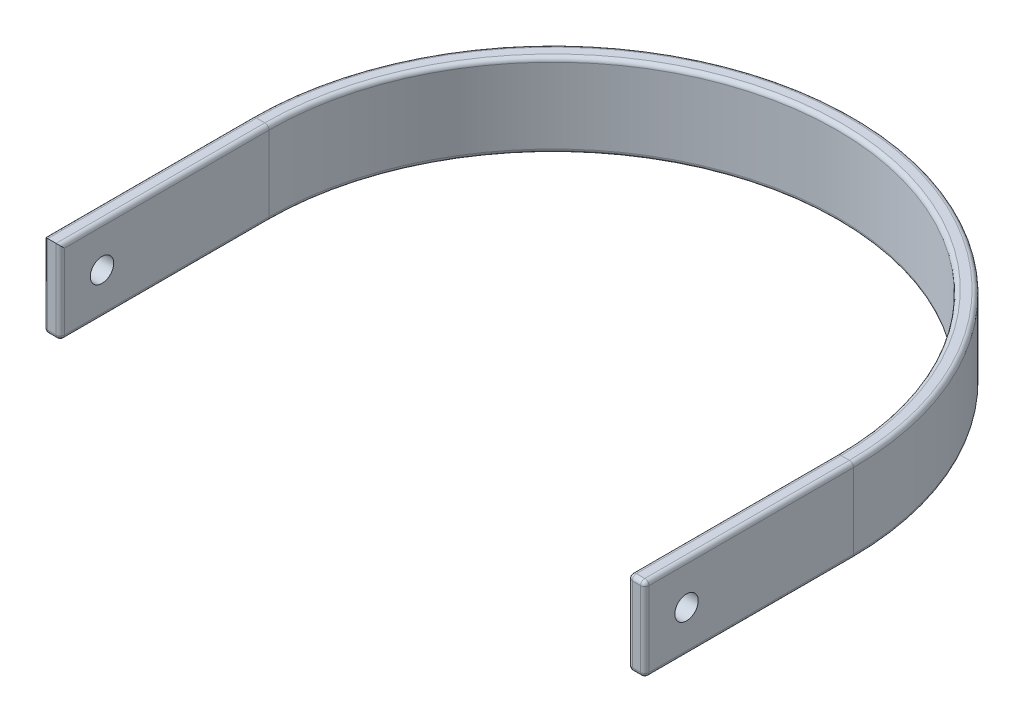
ISO-10303-21;
HEADER;
FILE_DESCRIPTION(('STEP AP214'),'2;1');
FILE_NAME('part.step','',(''),(''),'','','');
FILE_SCHEMA(('AUTOMOTIVE_DESIGN { 1 0 10303 214 1 1 1 1 }'));
ENDSEC;
DATA;
#1=APPLICATION_CONTEXT('core data for automotive mechanical design processes');
#2=APPLICATION_PROTOCOL_DEFINITION('international standard','automotive_design',2000,#1);
#3=PRODUCT_CONTEXT('',#1,'mechanical');
#4=PRODUCT('Part','Part','',(#3));
#5=PRODUCT_RELATED_PRODUCT_CATEGORY('part','',(#4));
#6=PRODUCT_DEFINITION_FORMATION('','',#4);
#7=PRODUCT_DEFINITION_CONTEXT('part definition',#1,'design');
#8=PRODUCT_DEFINITION('design','',#6,#7);
#9=PRODUCT_DEFINITION_SHAPE('','',#8);
#10=(LENGTH_UNIT() NAMED_UNIT(*) SI_UNIT(.MILLI.,.METRE.));
#11=(NAMED_UNIT(*) PLANE_ANGLE_UNIT() SI_UNIT($,.RADIAN.));
#12=(NAMED_UNIT(*) SI_UNIT($,.STERADIAN.) SOLID_ANGLE_UNIT());
#13=UNCERTAINTY_MEASURE_WITH_UNIT(LENGTH_MEASURE(1.E-05),#10,'distance_accuracy_value','');
#14=(GEOMETRIC_REPRESENTATION_CONTEXT(3) GLOBAL_UNCERTAINTY_ASSIGNED_CONTEXT((#13)) GLOBAL_UNIT_ASSIGNED_CONTEXT((#10,
#11,#12)) REPRESENTATION_CONTEXT('',''));
#15=CARTESIAN_POINT('',(0.,0.,0.));
#16=DIRECTION('',(0.,0.,1.));
#17=DIRECTION('',(1.,0.,0.));
#18=AXIS2_PLACEMENT_3D('',#15,#16,#17);
#19=CARTESIAN_POINT('',(0.,0.,0.));
#20=DIRECTION('',(0.,0.,1.));
#21=DIRECTION('',(1.,0.,0.));
#22=AXIS2_PLACEMENT_3D('',#19,#20,#21);
#23=PLANE('',#22);
#24=DIRECTION('',(1.,0.,0.));
#25=VECTOR('',#24,1.);
#26=CARTESIAN_POINT('',(1.,-4.5,0.));
#27=LINE('',#26,#25);
#28=CARTESIAN_POINT('',(-0.499999999999999,-4.5,0.));
#29=VERTEX_POINT('',#28);
#30=CARTESIAN_POINT('',(0.500000000000001,-4.5,0.));
#31=VERTEX_POINT('',#30);
#32=EDGE_CURVE('E194',#29,#31,#27,.T.);
#33=ORIENTED_EDGE('',*,*,#32,.T.);
#34=DIRECTION('',(0.,1.,0.));
#35=VECTOR('',#34,1.);
#36=CARTESIAN_POINT('',(0.5,5.,0.));
#37=LINE('',#36,#35);
#38=CARTESIAN_POINT('',(0.5,5.,0.));
#39=VERTEX_POINT('',#38);
#40=EDGE_CURVE('E177',#31,#39,#37,.T.);
#41=ORIENTED_EDGE('',*,*,#40,.T.);
#42=DIRECTION('',(-1.,0.,0.));
#43=VECTOR('',#42,1.);
#44=CARTESIAN_POINT('',(-1.,5.,0.));
#45=LINE('',#44,#43);
#46=CARTESIAN_POINT('',(-0.5,5.,0.));
#47=VERTEX_POINT('',#46);
#48=EDGE_CURVE('E191',#39,#47,#45,.T.);
#49=ORIENTED_EDGE('',*,*,#48,.T.);
#50=DIRECTION('',(0.,-1.,0.));
#51=VECTOR('',#50,1.);
#52=CARTESIAN_POINT('',(-0.499999999999999,-5.,0.));
#53=LINE('',#52,#51);
#54=EDGE_CURVE('E198',#47,#29,#53,.T.);
#55=ORIENTED_EDGE('',*,*,#54,.T.);
#56=EDGE_LOOP('',(#33,#41,#49,#55));
#57=FACE_BOUND('',#56,.T.);
#58=ADVANCED_FACE('F39',(#57),#23,.T.);
#59=CARTESIAN_POINT('',(70.,0.,0.));
#60=DIRECTION('',(0.,0.,-1.));
#61=DIRECTION('',(-1.,0.,0.));
#62=AXIS2_PLACEMENT_3D('',#59,#60,#61);
#63=PLANE('',#62);
#64=DIRECTION('',(0.,1.,0.));
#65=VECTOR('',#64,1.);
#66=CARTESIAN_POINT('',(69.5,0.,0.));
#67=LINE('',#66,#65);
#68=CARTESIAN_POINT('',(69.5,4.5,0.));
#69=VERTEX_POINT('',#68);
#70=CARTESIAN_POINT('',(69.5,-4.5,0.));
#71=VERTEX_POINT('',#70);
#72=EDGE_CURVE('E283',#69,#71,#67,.F.);
#73=ORIENTED_EDGE('',*,*,#72,.T.);
#74=DIRECTION('',(-1.,0.,0.));
#75=VECTOR('',#74,1.);
#76=CARTESIAN_POINT('',(70.,-4.5,0.));
#77=LINE('',#76,#75);
#78=CARTESIAN_POINT('',(70.5,-4.5,0.));
#79=VERTEX_POINT('',#78);
#80=EDGE_CURVE('E292',#71,#79,#77,.F.);
#81=ORIENTED_EDGE('',*,*,#80,.T.);
#82=DIRECTION('',(0.,-1.,0.));
#83=VECTOR('',#82,1.);
#84=CARTESIAN_POINT('',(70.5,0.,0.));
#85=LINE('',#84,#83);
#86=CARTESIAN_POINT('',(70.5,4.5,0.));
#87=VERTEX_POINT('',#86);
#88=EDGE_CURVE('E289',#79,#87,#85,.F.);
#89=ORIENTED_EDGE('',*,*,#88,.T.);
#90=DIRECTION('',(1.,0.,0.));
#91=VECTOR('',#90,1.);
#92=CARTESIAN_POINT('',(70.,4.5,0.));
#93=LINE('',#92,#91);
#94=EDGE_CURVE('E286',#87,#69,#93,.F.);
#95=ORIENTED_EDGE('',*,*,#94,.T.);
#96=EDGE_LOOP('',(#73,#81,#89,#95));
#97=FACE_BOUND('',#96,.T.);
#98=ADVANCED_FACE('F557',(#97),#63,.F.);
#99=CARTESIAN_POINT('',(-1.,5.,0.));
#100=DIRECTION('',(1.,0.,0.));
#101=DIRECTION('',(0.,1.,0.));
#102=AXIS2_PLACEMENT_3D('',#99,#100,#101);
#103=PLANE('',#102);
#104=CARTESIAN_POINT('',(-1.,0.,-5.));
#105=DIRECTION('',(-1.,0.,0.));
#106=DIRECTION('',(0.,-1.,0.));
#107=AXIS2_PLACEMENT_3D('',#104,#105,#106);
#108=CIRCLE('',#107,1.4);
#109=CARTESIAN_POINT('',(-1.,-1.4,-5.));
#110=VERTEX_POINT('',#109);
#111=EDGE_CURVE('E230',#110,#110,#108,.T.);
#112=ORIENTED_EDGE('',*,*,#111,.F.);
#113=EDGE_LOOP('',(#112));
#114=FACE_BOUND('',#113,.T.);
#115=DIRECTION('',(0.,-1.,0.));
#116=VECTOR('',#115,1.);
#117=CARTESIAN_POINT('',(-1.,5.,-25.));
#118=LINE('',#117,#116);
#119=CARTESIAN_POINT('',(-1.,4.5,-25.));
#120=VERTEX_POINT('',#119);
#121=CARTESIAN_POINT('',(-0.999999999999999,-4.5,-25.));
#122=VERTEX_POINT('',#121);
#123=EDGE_CURVE('E203',#120,#122,#118,.T.);
#124=ORIENTED_EDGE('',*,*,#123,.T.);
#125=DIRECTION('',(0.,0.,-1.));
#126=VECTOR('',#125,1.);
#127=CARTESIAN_POINT('',(-0.999999999999999,-4.5,0.));
#128=LINE('',#127,#126);
#129=CARTESIAN_POINT('',(-0.999999999999999,-4.5,-0.5));
#130=VERTEX_POINT('',#129);
#131=EDGE_CURVE('E249',#122,#130,#128,.F.);
#132=ORIENTED_EDGE('',*,*,#131,.T.);
#133=DIRECTION('',(0.,-1.,0.));
#134=VECTOR('',#133,1.);
#135=CARTESIAN_POINT('',(-1.,5.,-0.5));
#136=LINE('',#135,#134);
#137=CARTESIAN_POINT('',(-1.,4.5,-0.5));
#138=VERTEX_POINT('',#137);
#139=EDGE_CURVE('E245',#130,#138,#136,.F.);
#140=ORIENTED_EDGE('',*,*,#139,.T.);
#141=DIRECTION('',(0.,0.,-1.));
#142=VECTOR('',#141,1.);
#143=CARTESIAN_POINT('',(-1.,4.5,0.));
#144=LINE('',#143,#142);
#145=EDGE_CURVE('E242',#138,#120,#144,.T.);
#146=ORIENTED_EDGE('',*,*,#145,.T.);
#147=EDGE_LOOP('',(#124,#132,#140,#146));
#148=FACE_BOUND('',#147,.T.);
#149=ADVANCED_FACE('F589',(#114,#148),#103,.F.);
#150=CARTESIAN_POINT('',(-0.999999999999999,-5.,0.));
#151=DIRECTION('',(0.,1.,0.));
#152=DIRECTION('',(-1.,0.,0.));
#153=AXIS2_PLACEMENT_3D('',#150,#151,#152);
#154=PLANE('',#153);
#155=DIRECTION('',(1.,0.,0.));
#156=VECTOR('',#155,1.);
#157=CARTESIAN_POINT('',(-0.999999999999999,-5.,-25.));
#158=LINE('',#157,#156);
#159=CARTESIAN_POINT('',(-0.499999999999999,-5.,-25.));
#160=VERTEX_POINT('',#159);
#161=CARTESIAN_POINT('',(0.5,-5.,-25.));
#162=VERTEX_POINT('',#161);
#163=EDGE_CURVE('E209',#160,#162,#158,.T.);
#164=ORIENTED_EDGE('',*,*,#163,.T.);
#165=DIRECTION('',(0.,0.,-1.));
#166=VECTOR('',#165,1.);
#167=CARTESIAN_POINT('',(0.5,-5.,0.));
#168=LINE('',#167,#166);
#169=CARTESIAN_POINT('',(0.500000000000001,-5.,-0.5));
#170=VERTEX_POINT('',#169);
#171=EDGE_CURVE('E259',#162,#170,#168,.F.);
#172=ORIENTED_EDGE('',*,*,#171,.T.);
#173=DIRECTION('',(1.,0.,0.));
#174=VECTOR('',#173,1.);
#175=CARTESIAN_POINT('',(-0.999999999999999,-5.,-0.5));
#176=LINE('',#175,#174);
#177=CARTESIAN_POINT('',(-0.499999999999999,-5.,-0.5));
#178=VERTEX_POINT('',#177);
#179=EDGE_CURVE('E255',#170,#178,#176,.F.);
#180=ORIENTED_EDGE('',*,*,#179,.T.);
#181=DIRECTION('',(0.,0.,-1.));
#182=VECTOR('',#181,1.);
#183=CARTESIAN_POINT('',(-0.499999999999999,-5.,0.));
#184=LINE('',#183,#182);
#185=EDGE_CURVE('E252',#178,#160,#184,.T.);
#186=ORIENTED_EDGE('',*,*,#185,.T.);
#187=EDGE_LOOP('',(#164,#172,#180,#186));
#188=FACE_BOUND('',#187,.T.);
#189=ADVANCED_FACE('F879',(#188),#154,.F.);
#190=CARTESIAN_POINT('',(1.,5.,0.));
#191=DIRECTION('',(-1.,0.,0.));
#192=DIRECTION('',(0.,-1.,0.));
#193=AXIS2_PLACEMENT_3D('',#190,#191,#192);
#194=PLANE('',#193);
#195=CARTESIAN_POINT('',(1.,0.,-5.));
#196=DIRECTION('',(-1.,0.,0.));
#197=DIRECTION('',(0.,-1.,0.));
#198=AXIS2_PLACEMENT_3D('',#195,#196,#197);
#199=CIRCLE('',#198,1.4);
#200=CARTESIAN_POINT('',(1.,-1.4,-5.));
#201=VERTEX_POINT('',#200);
#202=EDGE_CURVE('E204',#201,#201,#199,.T.);
#203=ORIENTED_EDGE('',*,*,#202,.T.);
#204=EDGE_LOOP('',(#203));
#205=FACE_BOUND('',#204,.T.);
#206=DIRECTION('',(0.,1.,0.));
#207=VECTOR('',#206,1.);
#208=CARTESIAN_POINT('',(1.,-5.,-0.5));
#209=LINE('',#208,#207);
#210=CARTESIAN_POINT('',(1.,4.5,-0.5));
#211=VERTEX_POINT('',#210);
#212=CARTESIAN_POINT('',(1.,-4.5,-0.5));
#213=VERTEX_POINT('',#212);
#214=EDGE_CURVE('E179',#211,#213,#209,.F.);
#215=ORIENTED_EDGE('',*,*,#214,.T.);
#216=DIRECTION('',(0.,0.,-1.));
#217=VECTOR('',#216,1.);
#218=CARTESIAN_POINT('',(1.,-4.5,0.));
#219=LINE('',#218,#217);
#220=CARTESIAN_POINT('',(1.,-4.5,-25.));
#221=VERTEX_POINT('',#220);
#222=EDGE_CURVE('E239',#213,#221,#219,.T.);
#223=ORIENTED_EDGE('',*,*,#222,.T.);
#224=DIRECTION('',(0.,1.,0.));
#225=VECTOR('',#224,1.);
#226=CARTESIAN_POINT('',(1.,5.,-25.));
#227=LINE('',#226,#225);
#228=CARTESIAN_POINT('',(1.,4.5,-25.));
#229=VERTEX_POINT('',#228);
#230=EDGE_CURVE('E222',#221,#229,#227,.T.);
#231=ORIENTED_EDGE('',*,*,#230,.T.);
#232=DIRECTION('',(0.,0.,-1.));
#233=VECTOR('',#232,1.);
#234=CARTESIAN_POINT('',(1.,4.5,0.));
#235=LINE('',#234,#233);
#236=EDGE_CURVE('E197',#229,#211,#235,.F.);
#237=ORIENTED_EDGE('',*,*,#236,.T.);
#238=EDGE_LOOP('',(#215,#223,#231,#237));
#239=FACE_BOUND('',#238,.T.);
#240=ADVANCED_FACE('F464',(#205,#239),#194,.F.);
#241=CARTESIAN_POINT('',(-1.,5.,0.));
#242=DIRECTION('',(0.,-1.,0.));
#243=DIRECTION('',(0.,0.,-1.));
#244=AXIS2_PLACEMENT_3D('',#241,#242,#243);
#245=PLANE('',#244);
#246=ORIENTED_EDGE('',*,*,#48,.F.);
#247=DIRECTION('',(0.,0.,-1.));
#248=VECTOR('',#247,1.);
#249=CARTESIAN_POINT('',(0.5,5.,0.));
#250=LINE('',#249,#248);
#251=CARTESIAN_POINT('',(0.5,5.,-25.));
#252=VERTEX_POINT('',#251);
#253=EDGE_CURVE('E11',#39,#252,#250,.T.);
#254=ORIENTED_EDGE('',*,*,#253,.T.);
#255=DIRECTION('',(-1.,0.,0.));
#256=VECTOR('',#255,1.);
#257=CARTESIAN_POINT('',(-1.,5.,-25.));
#258=LINE('',#257,#256);
#259=CARTESIAN_POINT('',(-0.5,5.,-25.));
#260=VERTEX_POINT('',#259);
#261=EDGE_CURVE('E218',#252,#260,#258,.T.);
#262=ORIENTED_EDGE('',*,*,#261,.T.);
#263=DIRECTION('',(0.,0.,-1.));
#264=VECTOR('',#263,1.);
#265=CARTESIAN_POINT('',(-0.5,5.,0.));
#266=LINE('',#265,#264);
#267=EDGE_CURVE('E49',#260,#47,#266,.F.);
#268=ORIENTED_EDGE('',*,*,#267,.T.);
#269=EDGE_LOOP('',(#246,#254,#262,#268));
#270=FACE_BOUND('',#269,.T.);
#271=ADVANCED_FACE('F200',(#270),#245,.F.);
#272=CARTESIAN_POINT('',(35.,0.,-25.));
#273=DIRECTION('',(0.,-1.,0.));
#274=DIRECTION('',(0.,0.,-1.));
#275=AXIS2_PLACEMENT_3D('',#272,#273,#274);
#276=CYLINDRICAL_SURFACE('',#275,36.);
#277=DIRECTION('',(0.,-1.,0.));
#278=VECTOR('',#277,1.);
#279=CARTESIAN_POINT('',(71.,5.,-25.));
#280=LINE('',#279,#278);
#281=CARTESIAN_POINT('',(71.,4.5,-25.));
#282=VERTEX_POINT('',#281);
#283=CARTESIAN_POINT('',(71.,-4.5,-25.));
#284=VERTEX_POINT('',#283);
#285=EDGE_CURVE('E221',#282,#284,#280,.T.);
#286=ORIENTED_EDGE('',*,*,#285,.T.);
#287=CARTESIAN_POINT('',(35.,-4.5,-25.));
#288=DIRECTION('',(0.,1.,0.));
#289=DIRECTION('',(0.,0.,1.));
#290=AXIS2_PLACEMENT_3D('',#287,#288,#289);
#291=CIRCLE('',#290,36.);
#292=EDGE_CURVE('E326',#284,#122,#291,.T.);
#293=ORIENTED_EDGE('',*,*,#292,.T.);
#294=ORIENTED_EDGE('',*,*,#123,.F.);
#295=CARTESIAN_POINT('',(35.,4.5,-25.));
#296=DIRECTION('',(0.,-1.,0.));
#297=DIRECTION('',(0.,0.,-1.));
#298=AXIS2_PLACEMENT_3D('',#295,#296,#297);
#299=CIRCLE('',#298,36.);
#300=EDGE_CURVE('E323',#120,#282,#299,.T.);
#301=ORIENTED_EDGE('',*,*,#300,.T.);
#302=EDGE_LOOP('',(#286,#293,#294,#301));
#303=FACE_BOUND('',#302,.T.);
#304=ADVANCED_FACE('F856',(#303),#276,.T.);
#305=CARTESIAN_POINT('',(-0.999999999999999,-5.,-25.));
#306=DIRECTION('',(0.,1.,0.));
#307=DIRECTION('',(0.,0.,1.));
#308=AXIS2_PLACEMENT_3D('',#305,#306,#307);
#309=PLANE('',#308);
#310=DIRECTION('',(-1.,0.,0.));
#311=VECTOR('',#310,1.);
#312=CARTESIAN_POINT('',(71.,-5.,-25.));
#313=LINE('',#312,#311);
#314=CARTESIAN_POINT('',(70.5,-5.,-25.));
#315=VERTEX_POINT('',#314);
#316=CARTESIAN_POINT('',(69.5,-5.,-25.));
#317=VERTEX_POINT('',#316);
#318=EDGE_CURVE('E454',#315,#317,#313,.T.);
#319=ORIENTED_EDGE('',*,*,#318,.T.);
#320=CARTESIAN_POINT('',(35.,-5.,-25.));
#321=DIRECTION('',(0.,1.,0.));
#322=DIRECTION('',(0.,0.,1.));
#323=AXIS2_PLACEMENT_3D('',#320,#321,#322);
#324=CIRCLE('',#323,34.5);
#325=EDGE_CURVE('E271',#317,#162,#324,.T.);
#326=ORIENTED_EDGE('',*,*,#325,.T.);
#327=ORIENTED_EDGE('',*,*,#163,.F.);
#328=CARTESIAN_POINT('',(35.,-5.,-25.));
#329=DIRECTION('',(0.,1.,0.));
#330=DIRECTION('',(0.,0.,1.));
#331=AXIS2_PLACEMENT_3D('',#328,#329,#330);
#332=CIRCLE('',#331,35.5);
#333=EDGE_CURVE('E268',#160,#315,#332,.F.);
#334=ORIENTED_EDGE('',*,*,#333,.T.);
#335=EDGE_LOOP('',(#319,#326,#327,#334));
#336=FACE_BOUND('',#335,.T.);
#337=ADVANCED_FACE('F848',(#336),#309,.F.);
#338=CARTESIAN_POINT('',(35.,0.,-25.));
#339=DIRECTION('',(0.,-1.,0.));
#340=DIRECTION('',(0.,0.,-1.));
#341=AXIS2_PLACEMENT_3D('',#338,#339,#340);
#342=CYLINDRICAL_SURFACE('',#341,34.);
#343=ORIENTED_EDGE('',*,*,#230,.F.);
#344=CARTESIAN_POINT('',(35.,-4.5,-25.));
#345=DIRECTION('',(0.,1.,0.));
#346=DIRECTION('',(0.,0.,1.));
#347=AXIS2_PLACEMENT_3D('',#344,#345,#346);
#348=CIRCLE('',#347,34.);
#349=CARTESIAN_POINT('',(69.,-4.5,-25.));
#350=VERTEX_POINT('',#349);
#351=EDGE_CURVE('E265',#221,#350,#348,.F.);
#352=ORIENTED_EDGE('',*,*,#351,.T.);
#353=DIRECTION('',(0.,1.,0.));
#354=VECTOR('',#353,1.);
#355=CARTESIAN_POINT('',(69.,5.,-25.));
#356=LINE('',#355,#354);
#357=CARTESIAN_POINT('',(69.,4.5,-25.));
#358=VERTEX_POINT('',#357);
#359=EDGE_CURVE('E216',#350,#358,#356,.T.);
#360=ORIENTED_EDGE('',*,*,#359,.T.);
#361=CARTESIAN_POINT('',(35.,4.5,-25.));
#362=DIRECTION('',(0.,-1.,0.));
#363=DIRECTION('',(0.,0.,-1.));
#364=AXIS2_PLACEMENT_3D('',#361,#362,#363);
#365=CIRCLE('',#364,34.);
#366=EDGE_CURVE('E262',#358,#229,#365,.F.);
#367=ORIENTED_EDGE('',*,*,#366,.T.);
#368=EDGE_LOOP('',(#343,#352,#360,#367));
#369=FACE_BOUND('',#368,.T.);
#370=ADVANCED_FACE('F539',(#369),#342,.F.);
#371=CARTESIAN_POINT('',(-1.,5.,-25.));
#372=DIRECTION('',(0.,-1.,0.));
#373=DIRECTION('',(0.,0.,-1.));
#374=AXIS2_PLACEMENT_3D('',#371,#372,#373);
#375=PLANE('',#374);
#376=ORIENTED_EDGE('',*,*,#261,.F.);
#377=CARTESIAN_POINT('',(35.,5.,-25.));
#378=DIRECTION('',(0.,-1.,0.));
#379=DIRECTION('',(0.,0.,-1.));
#380=AXIS2_PLACEMENT_3D('',#377,#378,#379);
#381=CIRCLE('',#380,34.5);
#382=CARTESIAN_POINT('',(69.5,5.,-25.));
#383=VERTEX_POINT('',#382);
#384=EDGE_CURVE('E331',#252,#383,#381,.T.);
#385=ORIENTED_EDGE('',*,*,#384,.T.);
#386=DIRECTION('',(1.,0.,0.));
#387=VECTOR('',#386,1.);
#388=CARTESIAN_POINT('',(71.,5.,-25.));
#389=LINE('',#388,#387);
#390=CARTESIAN_POINT('',(70.5,5.,-25.));
#391=VERTEX_POINT('',#390);
#392=EDGE_CURVE('E223',#383,#391,#389,.T.);
#393=ORIENTED_EDGE('',*,*,#392,.T.);
#394=CARTESIAN_POINT('',(35.,5.,-25.));
#395=DIRECTION('',(0.,-1.,0.));
#396=DIRECTION('',(0.,0.,-1.));
#397=AXIS2_PLACEMENT_3D('',#394,#395,#396);
#398=CIRCLE('',#397,35.5);
#399=EDGE_CURVE('E57',#391,#260,#398,.F.);
#400=ORIENTED_EDGE('',*,*,#399,.T.);
#401=EDGE_LOOP('',(#376,#385,#393,#400));
#402=FACE_BOUND('',#401,.T.);
#403=ADVANCED_FACE('F474',(#402),#375,.F.);
#404=CARTESIAN_POINT('',(71.,5.,-25.));
#405=DIRECTION('',(-1.,0.,0.));
#406=DIRECTION('',(0.,-1.,0.));
#407=AXIS2_PLACEMENT_3D('',#404,#405,#406);
#408=PLANE('',#407);
#409=CARTESIAN_POINT('',(71.,0.,-5.));
#410=DIRECTION('',(-1.,0.,0.));
#411=DIRECTION('',(0.,-1.,0.));
#412=AXIS2_PLACEMENT_3D('',#409,#410,#411);
#413=CIRCLE('',#412,1.4);
#414=CARTESIAN_POINT('',(71.,-1.39999999999999,-5.));
#415=VERTEX_POINT('',#414);
#416=EDGE_CURVE('E212',#415,#415,#413,.T.);
#417=ORIENTED_EDGE('',*,*,#416,.T.);
#418=EDGE_LOOP('',(#417));
#419=FACE_BOUND('',#418,.T.);
#420=DIRECTION('',(0.,-1.,0.));
#421=VECTOR('',#420,1.);
#422=CARTESIAN_POINT('',(71.,5.,-0.5));
#423=LINE('',#422,#421);
#424=CARTESIAN_POINT('',(71.,4.5,-0.5));
#425=VERTEX_POINT('',#424);
#426=CARTESIAN_POINT('',(71.,-4.5,-0.5));
#427=VERTEX_POINT('',#426);
#428=EDGE_CURVE('E299',#425,#427,#423,.T.);
#429=ORIENTED_EDGE('',*,*,#428,.T.);
#430=DIRECTION('',(0.,0.,1.));
#431=VECTOR('',#430,1.);
#432=CARTESIAN_POINT('',(71.,-4.5,-25.));
#433=LINE('',#432,#431);
#434=EDGE_CURVE('E302',#427,#284,#433,.F.);
#435=ORIENTED_EDGE('',*,*,#434,.T.);
#436=ORIENTED_EDGE('',*,*,#285,.F.);
#437=DIRECTION('',(0.,0.,1.));
#438=VECTOR('',#437,1.);
#439=CARTESIAN_POINT('',(71.,4.5,-25.));
#440=LINE('',#439,#438);
#441=EDGE_CURVE('E296',#282,#425,#440,.T.);
#442=ORIENTED_EDGE('',*,*,#441,.T.);
#443=EDGE_LOOP('',(#429,#435,#436,#442));
#444=FACE_BOUND('',#443,.T.);
#445=ADVANCED_FACE('F502',(#419,#444),#408,.F.);
#446=CARTESIAN_POINT('',(71.,-5.,-25.));
#447=DIRECTION('',(0.,1.,0.));
#448=DIRECTION('',(-1.,0.,0.));
#449=AXIS2_PLACEMENT_3D('',#446,#447,#448);
#450=PLANE('',#449);
#451=ORIENTED_EDGE('',*,*,#318,.F.);
#452=DIRECTION('',(0.,0.,1.));
#453=VECTOR('',#452,1.);
#454=CARTESIAN_POINT('',(70.5,-5.,-25.));
#455=LINE('',#454,#453);
#456=CARTESIAN_POINT('',(70.5,-5.,-0.5));
#457=VERTEX_POINT('',#456);
#458=EDGE_CURVE('E280',#315,#457,#455,.T.);
#459=ORIENTED_EDGE('',*,*,#458,.T.);
#460=DIRECTION('',(-1.,0.,0.));
#461=VECTOR('',#460,1.);
#462=CARTESIAN_POINT('',(71.,-5.,-0.5));
#463=LINE('',#462,#461);
#464=CARTESIAN_POINT('',(69.5,-5.,-0.5));
#465=VERTEX_POINT('',#464);
#466=EDGE_CURVE('E277',#457,#465,#463,.T.);
#467=ORIENTED_EDGE('',*,*,#466,.T.);
#468=DIRECTION('',(0.,0.,1.));
#469=VECTOR('',#468,1.);
#470=CARTESIAN_POINT('',(69.5,-5.,-25.));
#471=LINE('',#470,#469);
#472=EDGE_CURVE('E274',#465,#317,#471,.F.);
#473=ORIENTED_EDGE('',*,*,#472,.T.);
#474=EDGE_LOOP('',(#451,#459,#467,#473));
#475=FACE_BOUND('',#474,.T.);
#476=ADVANCED_FACE('F561',(#475),#450,.F.);
#477=CARTESIAN_POINT('',(69.,5.,-25.));
#478=DIRECTION('',(1.,0.,0.));
#479=DIRECTION('',(0.,1.,0.));
#480=AXIS2_PLACEMENT_3D('',#477,#478,#479);
#481=PLANE('',#480);
#482=CARTESIAN_POINT('',(69.,0.,-5.));
#483=DIRECTION('',(1.,0.,0.));
#484=DIRECTION('',(0.,1.,0.));
#485=AXIS2_PLACEMENT_3D('',#482,#483,#484);
#486=CIRCLE('',#485,1.4);
#487=CARTESIAN_POINT('',(69.,1.40000000000001,-5.));
#488=VERTEX_POINT('',#487);
#489=EDGE_CURVE('E226',#488,#488,#486,.T.);
#490=ORIENTED_EDGE('',*,*,#489,.T.);
#491=EDGE_LOOP('',(#490));
#492=FACE_BOUND('',#491,.T.);
#493=ORIENTED_EDGE('',*,*,#359,.F.);
#494=DIRECTION('',(0.,0.,1.));
#495=VECTOR('',#494,1.);
#496=CARTESIAN_POINT('',(69.,-4.5,-25.));
#497=LINE('',#496,#495);
#498=CARTESIAN_POINT('',(69.,-4.5,-0.5));
#499=VERTEX_POINT('',#498);
#500=EDGE_CURVE('E320',#350,#499,#497,.T.);
#501=ORIENTED_EDGE('',*,*,#500,.T.);
#502=DIRECTION('',(0.,1.,0.));
#503=VECTOR('',#502,1.);
#504=CARTESIAN_POINT('',(69.,5.,-0.5));
#505=LINE('',#504,#503);
#506=CARTESIAN_POINT('',(69.,4.5,-0.5));
#507=VERTEX_POINT('',#506);
#508=EDGE_CURVE('E317',#499,#507,#505,.T.);
#509=ORIENTED_EDGE('',*,*,#508,.T.);
#510=DIRECTION('',(0.,0.,1.));
#511=VECTOR('',#510,1.);
#512=CARTESIAN_POINT('',(69.,4.5,-25.));
#513=LINE('',#512,#511);
#514=EDGE_CURVE('E314',#507,#358,#513,.F.);
#515=ORIENTED_EDGE('',*,*,#514,.T.);
#516=EDGE_LOOP('',(#493,#501,#509,#515));
#517=FACE_BOUND('',#516,.T.);
#518=ADVANCED_FACE('F542',(#492,#517),#481,.F.);
#519=CARTESIAN_POINT('',(71.,5.,-25.));
#520=DIRECTION('',(0.,-1.,0.));
#521=DIRECTION('',(0.,0.,-1.));
#522=AXIS2_PLACEMENT_3D('',#519,#520,#521);
#523=PLANE('',#522);
#524=DIRECTION('',(1.,0.,0.));
#525=VECTOR('',#524,1.);
#526=CARTESIAN_POINT('',(71.,5.,-0.5));
#527=LINE('',#526,#525);
#528=CARTESIAN_POINT('',(69.5,5.,-0.5));
#529=VERTEX_POINT('',#528);
#530=CARTESIAN_POINT('',(70.5,5.,-0.5));
#531=VERTEX_POINT('',#530);
#532=EDGE_CURVE('E308',#529,#531,#527,.T.);
#533=ORIENTED_EDGE('',*,*,#532,.T.);
#534=DIRECTION('',(0.,0.,1.));
#535=VECTOR('',#534,1.);
#536=CARTESIAN_POINT('',(70.5,5.,-25.));
#537=LINE('',#536,#535);
#538=EDGE_CURVE('E311',#531,#391,#537,.F.);
#539=ORIENTED_EDGE('',*,*,#538,.T.);
#540=ORIENTED_EDGE('',*,*,#392,.F.);
#541=DIRECTION('',(0.,0.,1.));
#542=VECTOR('',#541,1.);
#543=CARTESIAN_POINT('',(69.5,5.,-25.));
#544=LINE('',#543,#542);
#545=EDGE_CURVE('E305',#383,#529,#544,.T.);
#546=ORIENTED_EDGE('',*,*,#545,.T.);
#547=EDGE_LOOP('',(#533,#539,#540,#546));
#548=FACE_BOUND('',#547,.T.);
#549=ADVANCED_FACE('F478',(#548),#523,.F.);
#550=CARTESIAN_POINT('',(99.,0.,-5.));
#551=DIRECTION('',(-1.,0.,0.));
#552=DIRECTION('',(0.,-1.,0.));
#553=AXIS2_PLACEMENT_3D('',#550,#551,#552);
#554=CYLINDRICAL_SURFACE('',#553,1.4);
#555=ORIENTED_EDGE('',*,*,#489,.F.);
#556=EDGE_LOOP('',(#555));
#557=FACE_BOUND('',#556,.T.);
#558=ORIENTED_EDGE('',*,*,#416,.F.);
#559=EDGE_LOOP('',(#558));
#560=FACE_BOUND('',#559,.T.);
#561=ADVANCED_FACE('F573',(#557,#560),#554,.F.);
#562=ORIENTED_EDGE('',*,*,#111,.T.);
#563=EDGE_LOOP('',(#562));
#564=FACE_BOUND('',#563,.T.);
#565=ORIENTED_EDGE('',*,*,#202,.F.);
#566=EDGE_LOOP('',(#565));
#567=FACE_BOUND('',#566,.T.);
#568=ADVANCED_FACE('F568',(#564,#567),#554,.F.);
#569=CARTESIAN_POINT('',(70.5,-4.5,-0.5));
#570=DIRECTION('',(0.,0.,1.));
#571=DIRECTION('',(1.,0.,0.));
#572=AXIS2_PLACEMENT_3D('',#569,#570,#571);
#573=SPHERICAL_SURFACE('',#572,0.5);
#574=CARTESIAN_POINT('',(70.5,-4.5,-0.5));
#575=DIRECTION('',(0.,0.,1.));
#576=DIRECTION('',(1.,0.,0.));
#577=AXIS2_PLACEMENT_3D('',#574,#575,#576);
#578=CIRCLE('',#577,0.5);
#579=EDGE_CURVE('E426',#427,#457,#578,.F.);
#580=ORIENTED_EDGE('',*,*,#579,.F.);
#581=CARTESIAN_POINT('',(70.5,-4.5,-0.5));
#582=DIRECTION('',(0.,-1.,0.));
#583=DIRECTION('',(0.,0.,-1.));
#584=AXIS2_PLACEMENT_3D('',#581,#582,#583);
#585=CIRCLE('',#584,0.5);
#586=EDGE_CURVE('E43',#79,#427,#585,.F.);
#587=ORIENTED_EDGE('',*,*,#586,.F.);
#588=CARTESIAN_POINT('',(70.5,-4.5,-0.5));
#589=DIRECTION('',(1.,0.,0.));
#590=DIRECTION('',(0.,0.,-1.));
#591=AXIS2_PLACEMENT_3D('',#588,#589,#590);
#592=CIRCLE('',#591,0.5);
#593=EDGE_CURVE('E429',#457,#79,#592,.F.);
#594=ORIENTED_EDGE('',*,*,#593,.F.);
#595=EDGE_LOOP('',(#580,#587,#594));
#596=FACE_BOUND('',#595,.T.);
#597=ADVANCED_FACE('F41',(#596),#573,.T.);
#598=CARTESIAN_POINT('',(70.5,4.5,-25.));
#599=DIRECTION('',(0.,0.,1.));
#600=DIRECTION('',(1.,0.,0.));
#601=AXIS2_PLACEMENT_3D('',#598,#599,#600);
#602=CYLINDRICAL_SURFACE('',#601,0.5);
#603=CARTESIAN_POINT('',(70.5,4.5,-0.5));
#604=DIRECTION('',(0.,0.,1.));
#605=DIRECTION('',(1.,0.,0.));
#606=AXIS2_PLACEMENT_3D('',#603,#604,#605);
#607=CIRCLE('',#606,0.5);
#608=EDGE_CURVE('E418',#425,#531,#607,.T.);
#609=ORIENTED_EDGE('',*,*,#608,.F.);
#610=ORIENTED_EDGE('',*,*,#441,.F.);
#611=CARTESIAN_POINT('',(70.5,4.5,-25.));
#612=DIRECTION('',(0.,0.,-1.));
#613=DIRECTION('',(-1.,0.,0.));
#614=AXIS2_PLACEMENT_3D('',#611,#612,#613);
#615=CIRCLE('',#614,0.5);
#616=EDGE_CURVE('E422',#391,#282,#615,.T.);
#617=ORIENTED_EDGE('',*,*,#616,.F.);
#618=ORIENTED_EDGE('',*,*,#538,.F.);
#619=EDGE_LOOP('',(#609,#610,#617,#618));
#620=FACE_BOUND('',#619,.T.);
#621=ADVANCED_FACE('F495',(#620),#602,.T.);
#622=CARTESIAN_POINT('',(70.5,5.,-0.5));
#623=DIRECTION('',(0.,-1.,0.));
#624=DIRECTION('',(1.,0.,0.));
#625=AXIS2_PLACEMENT_3D('',#622,#623,#624);
#626=CYLINDRICAL_SURFACE('',#625,0.5);
#627=ORIENTED_EDGE('',*,*,#586,.T.);
#628=ORIENTED_EDGE('',*,*,#428,.F.);
#629=CARTESIAN_POINT('',(70.5,4.5,-0.5));
#630=DIRECTION('',(0.,1.,0.));
#631=DIRECTION('',(0.,0.,1.));
#632=AXIS2_PLACEMENT_3D('',#629,#630,#631);
#633=CIRCLE('',#632,0.5);
#634=EDGE_CURVE('E414',#87,#425,#633,.T.);
#635=ORIENTED_EDGE('',*,*,#634,.F.);
#636=ORIENTED_EDGE('',*,*,#88,.F.);
#637=EDGE_LOOP('',(#627,#628,#635,#636));
#638=FACE_BOUND('',#637,.T.);
#639=ADVANCED_FACE('F500',(#638),#626,.T.);
#640=CARTESIAN_POINT('',(71.,-4.5,-0.5));
#641=DIRECTION('',(-1.,0.,0.));
#642=DIRECTION('',(0.,-1.,0.));
#643=AXIS2_PLACEMENT_3D('',#640,#641,#642);
#644=CYLINDRICAL_SURFACE('',#643,0.5);
#645=ORIENTED_EDGE('',*,*,#593,.T.);
#646=ORIENTED_EDGE('',*,*,#80,.F.);
#647=CARTESIAN_POINT('',(69.5,-4.5,-0.5));
#648=DIRECTION('',(-1.,0.,0.));
#649=DIRECTION('',(0.,0.,1.));
#650=AXIS2_PLACEMENT_3D('',#647,#648,#649);
#651=CIRCLE('',#650,0.5);
#652=EDGE_CURVE('E410',#465,#71,#651,.T.);
#653=ORIENTED_EDGE('',*,*,#652,.F.);
#654=ORIENTED_EDGE('',*,*,#466,.F.);
#655=EDGE_LOOP('',(#645,#646,#653,#654));
#656=FACE_BOUND('',#655,.T.);
#657=ADVANCED_FACE('F558',(#656),#644,.T.);
#658=CARTESIAN_POINT('',(70.5,-4.5,-25.));
#659=DIRECTION('',(0.,0.,1.));
#660=DIRECTION('',(1.,0.,0.));
#661=AXIS2_PLACEMENT_3D('',#658,#659,#660);
#662=CYLINDRICAL_SURFACE('',#661,0.5);
#663=ORIENTED_EDGE('',*,*,#579,.T.);
#664=ORIENTED_EDGE('',*,*,#458,.F.);
#665=CARTESIAN_POINT('',(70.5,-4.5,-25.));
#666=DIRECTION('',(0.,0.,-1.));
#667=DIRECTION('',(-1.,0.,0.));
#668=AXIS2_PLACEMENT_3D('',#665,#666,#667);
#669=CIRCLE('',#668,0.5);
#670=EDGE_CURVE('E406',#284,#315,#669,.T.);
#671=ORIENTED_EDGE('',*,*,#670,.F.);
#672=ORIENTED_EDGE('',*,*,#434,.F.);
#673=EDGE_LOOP('',(#663,#664,#671,#672));
#674=FACE_BOUND('',#673,.T.);
#675=ADVANCED_FACE('F565',(#674),#662,.T.);
#676=CARTESIAN_POINT('',(35.,4.5,-25.));
#677=DIRECTION('',(0.,-1.,0.));
#678=DIRECTION('',(0.,0.,-1.));
#679=AXIS2_PLACEMENT_3D('',#676,#677,#678);
#680=TOROIDAL_SURFACE('',#679,35.5,0.5);
#681=ORIENTED_EDGE('',*,*,#616,.T.);
#682=ORIENTED_EDGE('',*,*,#300,.F.);
#683=CARTESIAN_POINT('',(-0.5,4.5,-25.));
#684=DIRECTION('',(0.,0.,1.));
#685=DIRECTION('',(1.,0.,0.));
#686=AXIS2_PLACEMENT_3D('',#683,#684,#685);
#687=CIRCLE('',#686,0.5);
#688=EDGE_CURVE('E402',#260,#120,#687,.T.);
#689=ORIENTED_EDGE('',*,*,#688,.F.);
#690=ORIENTED_EDGE('',*,*,#399,.F.);
#691=EDGE_LOOP('',(#681,#682,#689,#690));
#692=FACE_BOUND('',#691,.T.);
#693=ADVANCED_FACE('F507',(#692),#680,.T.);
#694=CARTESIAN_POINT('',(70.5,4.5,-0.5));
#695=DIRECTION('',(1.,0.,0.));
#696=DIRECTION('',(0.,0.,-1.));
#697=AXIS2_PLACEMENT_3D('',#694,#695,#696);
#698=SPHERICAL_SURFACE('',#697,0.5);
#699=ORIENTED_EDGE('',*,*,#634,.T.);
#700=ORIENTED_EDGE('',*,*,#608,.T.);
#701=CARTESIAN_POINT('',(70.5,4.5,-0.5));
#702=DIRECTION('',(1.,0.,0.));
#703=DIRECTION('',(0.,0.,-1.));
#704=AXIS2_PLACEMENT_3D('',#701,#702,#703);
#705=CIRCLE('',#704,0.5);
#706=EDGE_CURVE('E398',#87,#531,#705,.F.);
#707=ORIENTED_EDGE('',*,*,#706,.F.);
#708=EDGE_LOOP('',(#699,#700,#707));
#709=FACE_BOUND('',#708,.T.);
#710=ADVANCED_FACE('F498',(#709),#698,.T.);
#711=CARTESIAN_POINT('',(69.5,-4.5,-0.5));
#712=DIRECTION('',(0.,0.,1.));
#713=DIRECTION('',(1.,0.,0.));
#714=AXIS2_PLACEMENT_3D('',#711,#712,#713);
#715=SPHERICAL_SURFACE('',#714,0.5);
#716=CARTESIAN_POINT('',(69.5,-4.5,-0.5));
#717=DIRECTION('',(0.,0.,1.));
#718=DIRECTION('',(1.,0.,0.));
#719=AXIS2_PLACEMENT_3D('',#716,#717,#718);
#720=CIRCLE('',#719,0.5);
#721=EDGE_CURVE('E390',#465,#499,#720,.F.);
#722=ORIENTED_EDGE('',*,*,#721,.F.);
#723=ORIENTED_EDGE('',*,*,#652,.T.);
#724=CARTESIAN_POINT('',(69.5,-4.5,-0.5));
#725=DIRECTION('',(0.,-1.,0.));
#726=DIRECTION('',(1.,0.,0.));
#727=AXIS2_PLACEMENT_3D('',#724,#725,#726);
#728=CIRCLE('',#727,0.5);
#729=EDGE_CURVE('E394',#499,#71,#728,.F.);
#730=ORIENTED_EDGE('',*,*,#729,.F.);
#731=EDGE_LOOP('',(#722,#723,#730));
#732=FACE_BOUND('',#731,.T.);
#733=ADVANCED_FACE('F551',(#732),#715,.T.);
#734=CARTESIAN_POINT('',(35.,-4.5,-25.));
#735=DIRECTION('',(0.,1.,0.));
#736=DIRECTION('',(0.,0.,1.));
#737=AXIS2_PLACEMENT_3D('',#734,#735,#736);
#738=TOROIDAL_SURFACE('',#737,35.5,0.5);
#739=ORIENTED_EDGE('',*,*,#670,.T.);
#740=ORIENTED_EDGE('',*,*,#333,.F.);
#741=CARTESIAN_POINT('',(-0.499999999999999,-4.5,-25.));
#742=DIRECTION('',(0.,0.,1.));
#743=DIRECTION('',(1.,0.,0.));
#744=AXIS2_PLACEMENT_3D('',#741,#742,#743);
#745=CIRCLE('',#744,0.5);
#746=EDGE_CURVE('E386',#122,#160,#745,.T.);
#747=ORIENTED_EDGE('',*,*,#746,.F.);
#748=ORIENTED_EDGE('',*,*,#292,.F.);
#749=EDGE_LOOP('',(#739,#740,#747,#748));
#750=FACE_BOUND('',#749,.T.);
#751=ADVANCED_FACE('F626',(#750),#738,.T.);
#752=CARTESIAN_POINT('',(-0.5,4.5,0.));
#753=DIRECTION('',(0.,0.,-1.));
#754=DIRECTION('',(-1.,0.,0.));
#755=AXIS2_PLACEMENT_3D('',#752,#753,#754);
#756=CYLINDRICAL_SURFACE('',#755,0.5);
#757=ORIENTED_EDGE('',*,*,#688,.T.);
#758=ORIENTED_EDGE('',*,*,#145,.F.);
#759=CARTESIAN_POINT('',(-0.5,4.5,-0.5));
#760=DIRECTION('',(0.,0.707106781186547,-0.707106781186547));
#761=DIRECTION('',(0.,-0.707106781186547,-0.707106781186547));
#762=AXIS2_PLACEMENT_3D('',#759,#760,#761);
#763=ELLIPSE('',#762,0.707106781186547,0.5);
#764=EDGE_CURVE('E383',#47,#138,#763,.F.);
#765=ORIENTED_EDGE('',*,*,#764,.F.);
#766=ORIENTED_EDGE('',*,*,#267,.F.);
#767=EDGE_LOOP('',(#757,#758,#765,#766));
#768=FACE_BOUND('',#767,.T.);
#769=ADVANCED_FACE('F511',(#768),#756,.T.);
#770=CARTESIAN_POINT('',(71.,4.5,-0.5));
#771=DIRECTION('',(1.,0.,0.));
#772=DIRECTION('',(0.,0.,-1.));
#773=AXIS2_PLACEMENT_3D('',#770,#771,#772);
#774=CYLINDRICAL_SURFACE('',#773,0.5);
#775=ORIENTED_EDGE('',*,*,#706,.T.);
#776=ORIENTED_EDGE('',*,*,#532,.F.);
#777=CARTESIAN_POINT('',(69.5,4.5,-0.5));
#778=DIRECTION('',(-1.,0.,0.));
#779=DIRECTION('',(0.,0.,1.));
#780=AXIS2_PLACEMENT_3D('',#777,#778,#779);
#781=CIRCLE('',#780,0.5);
#782=EDGE_CURVE('E379',#69,#529,#781,.T.);
#783=ORIENTED_EDGE('',*,*,#782,.F.);
#784=ORIENTED_EDGE('',*,*,#94,.F.);
#785=EDGE_LOOP('',(#775,#776,#783,#784));
#786=FACE_BOUND('',#785,.T.);
#787=ADVANCED_FACE('F491',(#786),#774,.T.);
#788=CARTESIAN_POINT('',(69.5,5.,-0.5));
#789=DIRECTION('',(0.,1.,0.));
#790=DIRECTION('',(-1.,0.,0.));
#791=AXIS2_PLACEMENT_3D('',#788,#789,#790);
#792=CYLINDRICAL_SURFACE('',#791,0.5);
#793=ORIENTED_EDGE('',*,*,#729,.T.);
#794=ORIENTED_EDGE('',*,*,#72,.F.);
#795=CARTESIAN_POINT('',(69.5,4.5,-0.5));
#796=DIRECTION('',(0.,1.,0.));
#797=DIRECTION('',(0.,0.,1.));
#798=AXIS2_PLACEMENT_3D('',#795,#796,#797);
#799=CIRCLE('',#798,0.5);
#800=EDGE_CURVE('E375',#507,#69,#799,.T.);
#801=ORIENTED_EDGE('',*,*,#800,.F.);
#802=ORIENTED_EDGE('',*,*,#508,.F.);
#803=EDGE_LOOP('',(#793,#794,#801,#802));
#804=FACE_BOUND('',#803,.T.);
#805=ADVANCED_FACE('F555',(#804),#792,.T.);
#806=CARTESIAN_POINT('',(69.5,-4.5,-25.));
#807=DIRECTION('',(0.,0.,1.));
#808=DIRECTION('',(1.,0.,0.));
#809=AXIS2_PLACEMENT_3D('',#806,#807,#808);
#810=CYLINDRICAL_SURFACE('',#809,0.5);
#811=ORIENTED_EDGE('',*,*,#721,.T.);
#812=ORIENTED_EDGE('',*,*,#500,.F.);
#813=CARTESIAN_POINT('',(69.5,-4.5,-25.));
#814=DIRECTION('',(0.,0.,-1.));
#815=DIRECTION('',(-1.,0.,0.));
#816=AXIS2_PLACEMENT_3D('',#813,#814,#815);
#817=CIRCLE('',#816,0.5);
#818=EDGE_CURVE('E371',#317,#350,#817,.T.);
#819=ORIENTED_EDGE('',*,*,#818,.F.);
#820=ORIENTED_EDGE('',*,*,#472,.F.);
#821=EDGE_LOOP('',(#811,#812,#819,#820));
#822=FACE_BOUND('',#821,.T.);
#823=ADVANCED_FACE('F545',(#822),#810,.T.);
#824=CARTESIAN_POINT('',(-0.499999999999999,-4.5,0.));
#825=DIRECTION('',(0.,0.,-1.));
#826=DIRECTION('',(-1.,0.,0.));
#827=AXIS2_PLACEMENT_3D('',#824,#825,#826);
#828=CYLINDRICAL_SURFACE('',#827,0.5);
#829=ORIENTED_EDGE('',*,*,#746,.T.);
#830=ORIENTED_EDGE('',*,*,#185,.F.);
#831=CARTESIAN_POINT('',(-0.499999999999999,-4.5,-0.5));
#832=DIRECTION('',(0.,0.,1.));
#833=DIRECTION('',(1.,0.,0.));
#834=AXIS2_PLACEMENT_3D('',#831,#832,#833);
#835=CIRCLE('',#834,0.5);
#836=EDGE_CURVE('E367',#130,#178,#835,.T.);
#837=ORIENTED_EDGE('',*,*,#836,.F.);
#838=ORIENTED_EDGE('',*,*,#131,.F.);
#839=EDGE_LOOP('',(#829,#830,#837,#838));
#840=FACE_BOUND('',#839,.T.);
#841=ADVANCED_FACE('F614',(#840),#828,.T.);
#842=CARTESIAN_POINT('',(-0.5,0.,-0.5));
#843=DIRECTION('',(0.,1.,0.));
#844=DIRECTION('',(-1.,0.,0.));
#845=AXIS2_PLACEMENT_3D('',#842,#843,#844);
#846=CYLINDRICAL_SURFACE('',#845,0.5);
#847=ORIENTED_EDGE('',*,*,#764,.T.);
#848=ORIENTED_EDGE('',*,*,#139,.F.);
#849=CARTESIAN_POINT('',(-0.499999999999999,-4.5,-0.5));
#850=DIRECTION('',(0.,-1.,0.));
#851=DIRECTION('',(0.,0.,-1.));
#852=AXIS2_PLACEMENT_3D('',#849,#850,#851);
#853=CIRCLE('',#852,0.5);
#854=EDGE_CURVE('E363',#29,#130,#853,.T.);
#855=ORIENTED_EDGE('',*,*,#854,.F.);
#856=ORIENTED_EDGE('',*,*,#54,.F.);
#857=EDGE_LOOP('',(#847,#848,#855,#856));
#858=FACE_BOUND('',#857,.T.);
#859=ADVANCED_FACE('F516',(#858),#846,.T.);
#860=CARTESIAN_POINT('',(69.5,4.5,-0.5));
#861=DIRECTION('',(0.,0.,1.));
#862=DIRECTION('',(1.,0.,0.));
#863=AXIS2_PLACEMENT_3D('',#860,#861,#862);
#864=SPHERICAL_SURFACE('',#863,0.5);
#865=ORIENTED_EDGE('',*,*,#800,.T.);
#866=ORIENTED_EDGE('',*,*,#782,.T.);
#867=CARTESIAN_POINT('',(69.5,4.5,-0.5));
#868=DIRECTION('',(0.,0.,1.));
#869=DIRECTION('',(1.,0.,0.));
#870=AXIS2_PLACEMENT_3D('',#867,#868,#869);
#871=CIRCLE('',#870,0.5);
#872=EDGE_CURVE('E359',#507,#529,#871,.F.);
#873=ORIENTED_EDGE('',*,*,#872,.F.);
#874=EDGE_LOOP('',(#865,#866,#873));
#875=FACE_BOUND('',#874,.T.);
#876=ADVANCED_FACE('F486',(#875),#864,.T.);
#877=CARTESIAN_POINT('',(35.,-4.5,-25.));
#878=DIRECTION('',(0.,1.,0.));
#879=DIRECTION('',(0.,0.,1.));
#880=AXIS2_PLACEMENT_3D('',#877,#878,#879);
#881=TOROIDAL_SURFACE('',#880,34.5,0.5);
#882=ORIENTED_EDGE('',*,*,#818,.T.);
#883=ORIENTED_EDGE('',*,*,#351,.F.);
#884=CARTESIAN_POINT('',(0.500000000000001,-4.5,-25.));
#885=DIRECTION('',(0.,0.,1.));
#886=DIRECTION('',(1.,0.,0.));
#887=AXIS2_PLACEMENT_3D('',#884,#885,#886);
#888=CIRCLE('',#887,0.5);
#889=EDGE_CURVE('E355',#162,#221,#888,.T.);
#890=ORIENTED_EDGE('',*,*,#889,.F.);
#891=ORIENTED_EDGE('',*,*,#325,.F.);
#892=EDGE_LOOP('',(#882,#883,#890,#891));
#893=FACE_BOUND('',#892,.T.);
#894=ADVANCED_FACE('F535',(#893),#881,.T.);
#895=CARTESIAN_POINT('',(-0.499999999999999,-4.5,-0.5));
#896=DIRECTION('',(-1.,0.,0.));
#897=DIRECTION('',(0.,0.,1.));
#898=AXIS2_PLACEMENT_3D('',#895,#896,#897);
#899=SPHERICAL_SURFACE('',#898,0.5);
#900=ORIENTED_EDGE('',*,*,#854,.T.);
#901=ORIENTED_EDGE('',*,*,#836,.T.);
#902=CARTESIAN_POINT('',(-0.499999999999999,-4.5,-0.5));
#903=DIRECTION('',(-1.,0.,0.));
#904=DIRECTION('',(0.,-1.,0.));
#905=AXIS2_PLACEMENT_3D('',#902,#903,#904);
#906=CIRCLE('',#905,0.5);
#907=EDGE_CURVE('E352',#29,#178,#906,.F.);
#908=ORIENTED_EDGE('',*,*,#907,.F.);
#909=EDGE_LOOP('',(#900,#901,#908));
#910=FACE_BOUND('',#909,.T.);
#911=ADVANCED_FACE('F520',(#910),#899,.T.);
#912=CARTESIAN_POINT('',(69.5,4.5,-25.));
#913=DIRECTION('',(0.,0.,1.));
#914=DIRECTION('',(1.,0.,0.));
#915=AXIS2_PLACEMENT_3D('',#912,#913,#914);
#916=CYLINDRICAL_SURFACE('',#915,0.5);
#917=ORIENTED_EDGE('',*,*,#872,.T.);
#918=ORIENTED_EDGE('',*,*,#545,.F.);
#919=CARTESIAN_POINT('',(69.5,4.5,-25.));
#920=DIRECTION('',(0.,0.,-1.));
#921=DIRECTION('',(-1.,0.,0.));
#922=AXIS2_PLACEMENT_3D('',#919,#920,#921);
#923=CIRCLE('',#922,0.5);
#924=EDGE_CURVE('E348',#358,#383,#923,.T.);
#925=ORIENTED_EDGE('',*,*,#924,.F.);
#926=ORIENTED_EDGE('',*,*,#514,.F.);
#927=EDGE_LOOP('',(#917,#918,#925,#926));
#928=FACE_BOUND('',#927,.T.);
#929=ADVANCED_FACE('F482',(#928),#916,.T.);
#930=CARTESIAN_POINT('',(0.500000000000001,-4.5,0.));
#931=DIRECTION('',(0.,0.,-1.));
#932=DIRECTION('',(-1.,0.,0.));
#933=AXIS2_PLACEMENT_3D('',#930,#931,#932);
#934=CYLINDRICAL_SURFACE('',#933,0.5);
#935=ORIENTED_EDGE('',*,*,#889,.T.);
#936=ORIENTED_EDGE('',*,*,#222,.F.);
#937=CARTESIAN_POINT('',(0.500000000000001,-4.5,-0.5));
#938=DIRECTION('',(0.,0.,1.));
#939=DIRECTION('',(1.,0.,0.));
#940=AXIS2_PLACEMENT_3D('',#937,#938,#939);
#941=CIRCLE('',#940,0.5);
#942=EDGE_CURVE('E344',#170,#213,#941,.T.);
#943=ORIENTED_EDGE('',*,*,#942,.F.);
#944=ORIENTED_EDGE('',*,*,#171,.F.);
#945=EDGE_LOOP('',(#935,#936,#943,#944));
#946=FACE_BOUND('',#945,.T.);
#947=ADVANCED_FACE('F531',(#946),#934,.T.);
#948=CARTESIAN_POINT('',(0.,-4.5,-0.5));
#949=DIRECTION('',(-1.,0.,0.));
#950=DIRECTION('',(0.,-1.,0.));
#951=AXIS2_PLACEMENT_3D('',#948,#949,#950);
#952=CYLINDRICAL_SURFACE('',#951,0.5);
#953=ORIENTED_EDGE('',*,*,#907,.T.);
#954=ORIENTED_EDGE('',*,*,#179,.F.);
#955=CARTESIAN_POINT('',(0.500000000000001,-4.5,-0.5));
#956=DIRECTION('',(1.,0.,0.));
#957=DIRECTION('',(0.,1.,0.));
#958=AXIS2_PLACEMENT_3D('',#955,#956,#957);
#959=CIRCLE('',#958,0.5);
#960=EDGE_CURVE('E340',#31,#170,#959,.T.);
#961=ORIENTED_EDGE('',*,*,#960,.F.);
#962=ORIENTED_EDGE('',*,*,#32,.F.);
#963=EDGE_LOOP('',(#953,#954,#961,#962));
#964=FACE_BOUND('',#963,.T.);
#965=ADVANCED_FACE('F524',(#964),#952,.T.);
#966=CARTESIAN_POINT('',(35.,4.5,-25.));
#967=DIRECTION('',(0.,-1.,0.));
#968=DIRECTION('',(0.,0.,-1.));
#969=AXIS2_PLACEMENT_3D('',#966,#967,#968);
#970=TOROIDAL_SURFACE('',#969,34.5,0.5);
#971=ORIENTED_EDGE('',*,*,#924,.T.);
#972=ORIENTED_EDGE('',*,*,#384,.F.);
#973=CARTESIAN_POINT('',(0.5,4.5,-25.));
#974=DIRECTION('',(0.,0.,1.));
#975=DIRECTION('',(1.,0.,0.));
#976=AXIS2_PLACEMENT_3D('',#973,#974,#975);
#977=CIRCLE('',#976,0.5);
#978=EDGE_CURVE('E188',#229,#252,#977,.T.);
#979=ORIENTED_EDGE('',*,*,#978,.F.);
#980=ORIENTED_EDGE('',*,*,#366,.F.);
#981=EDGE_LOOP('',(#971,#972,#979,#980));
#982=FACE_BOUND('',#981,.T.);
#983=ADVANCED_FACE('F471',(#982),#970,.T.);
#984=CARTESIAN_POINT('',(0.500000000000001,-4.5,-0.5));
#985=DIRECTION('',(0.,-1.,0.));
#986=DIRECTION('',(1.,0.,0.));
#987=AXIS2_PLACEMENT_3D('',#984,#985,#986);
#988=SPHERICAL_SURFACE('',#987,0.5);
#989=ORIENTED_EDGE('',*,*,#960,.T.);
#990=ORIENTED_EDGE('',*,*,#942,.T.);
#991=CARTESIAN_POINT('',(0.500000000000001,-4.5,-0.5));
#992=DIRECTION('',(0.,-1.,0.));
#993=DIRECTION('',(0.,0.,-1.));
#994=AXIS2_PLACEMENT_3D('',#991,#992,#993);
#995=CIRCLE('',#994,0.5);
#996=EDGE_CURVE('E183',#31,#213,#995,.F.);
#997=ORIENTED_EDGE('',*,*,#996,.F.);
#998=EDGE_LOOP('',(#989,#990,#997));
#999=FACE_BOUND('',#998,.T.);
#1000=ADVANCED_FACE('F528',(#999),#988,.T.);
#1001=CARTESIAN_POINT('',(0.5,4.5,0.));
#1002=DIRECTION('',(0.,0.,-1.));
#1003=DIRECTION('',(-1.,0.,0.));
#1004=AXIS2_PLACEMENT_3D('',#1001,#1002,#1003);
#1005=CYLINDRICAL_SURFACE('',#1004,0.5);
#1006=ORIENTED_EDGE('',*,*,#978,.T.);
#1007=ORIENTED_EDGE('',*,*,#253,.F.);
#1008=CARTESIAN_POINT('',(0.5,4.5,-0.5));
#1009=DIRECTION('',(0.,0.707106781186547,-0.707106781186547));
#1010=DIRECTION('',(0.,-0.707106781186547,-0.707106781186547));
#1011=AXIS2_PLACEMENT_3D('',#1008,#1009,#1010);
#1012=ELLIPSE('',#1011,0.707106781186547,0.5);
#1013=EDGE_CURVE('E174',#211,#39,#1012,.F.);
#1014=ORIENTED_EDGE('',*,*,#1013,.F.);
#1015=ORIENTED_EDGE('',*,*,#236,.F.);
#1016=EDGE_LOOP('',(#1006,#1007,#1014,#1015));
#1017=FACE_BOUND('',#1016,.T.);
#1018=ADVANCED_FACE('F186',(#1017),#1005,.T.);
#1019=CARTESIAN_POINT('',(0.5,0.,-0.5));
#1020=DIRECTION('',(0.,-1.,0.));
#1021=DIRECTION('',(1.,0.,0.));
#1022=AXIS2_PLACEMENT_3D('',#1019,#1020,#1021);
#1023=CYLINDRICAL_SURFACE('',#1022,0.5);
#1024=ORIENTED_EDGE('',*,*,#996,.T.);
#1025=ORIENTED_EDGE('',*,*,#214,.F.);
#1026=ORIENTED_EDGE('',*,*,#1013,.T.);
#1027=ORIENTED_EDGE('',*,*,#40,.F.);
#1028=EDGE_LOOP('',(#1024,#1025,#1026,#1027));
#1029=FACE_BOUND('',#1028,.T.);
#1030=ADVANCED_FACE('F175',(#1029),#1023,.T.);
#1031=CLOSED_SHELL('',(#58,#98,#149,#189,#240,#271,#304,#337,#370,#403,#445,#476,#518,#549,#561,
#568,#597,#621,#639,#657,#675,#693,#710,#733,#751,#769,#787,#805,#823,#841,#859,#876,#894,#911,
#929,#947,#965,#983,#1000,#1018,#1030));
#1032=MANIFOLD_SOLID_BREP('B2',#1031);
#1033=ADVANCED_BREP_SHAPE_REPRESENTATION('',(#18,#1032),#14);
#1034=SHAPE_DEFINITION_REPRESENTATION(#9,#1033);
ENDSEC;
END-ISO-10303-21;
